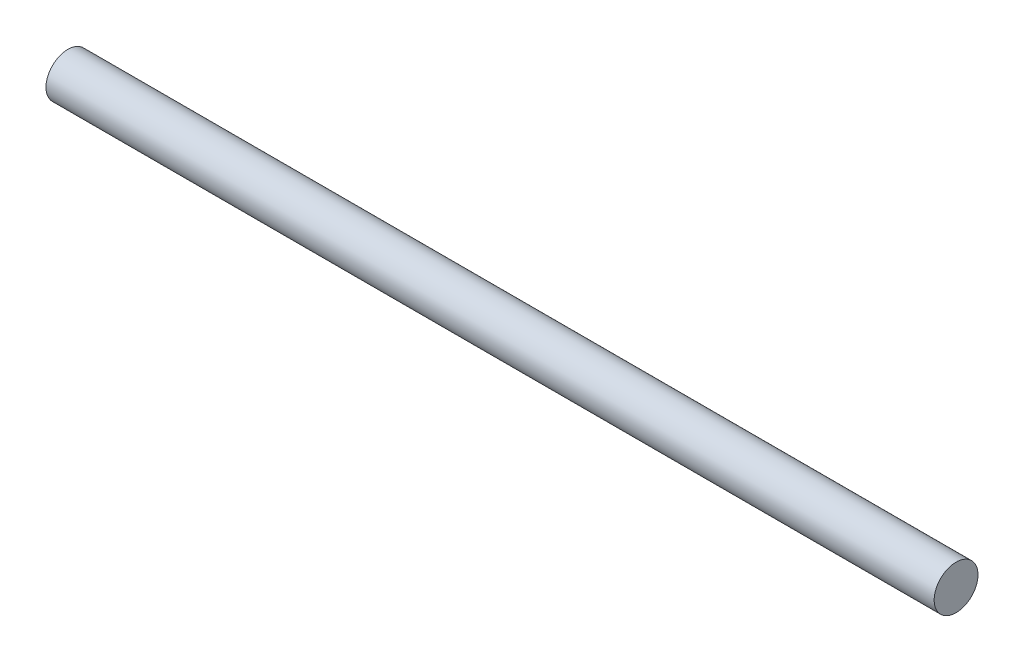
ISO-10303-21;
HEADER;
FILE_DESCRIPTION(('STEP AP214'),'2;1');
FILE_NAME('part.step','',(''),(''),'','','');
FILE_SCHEMA(('AUTOMOTIVE_DESIGN { 1 0 10303 214 1 1 1 1 }'));
ENDSEC;
DATA;
#1=APPLICATION_CONTEXT('core data for automotive mechanical design processes');
#2=APPLICATION_PROTOCOL_DEFINITION('international standard','automotive_design',2000,#1);
#3=PRODUCT_CONTEXT('',#1,'mechanical');
#4=PRODUCT('Part','Part','',(#3));
#5=PRODUCT_RELATED_PRODUCT_CATEGORY('part','',(#4));
#6=PRODUCT_DEFINITION_FORMATION('','',#4);
#7=PRODUCT_DEFINITION_CONTEXT('part definition',#1,'design');
#8=PRODUCT_DEFINITION('design','',#6,#7);
#9=PRODUCT_DEFINITION_SHAPE('','',#8);
#10=(LENGTH_UNIT() NAMED_UNIT(*) SI_UNIT(.MILLI.,.METRE.));
#11=(NAMED_UNIT(*) PLANE_ANGLE_UNIT() SI_UNIT($,.RADIAN.));
#12=(NAMED_UNIT(*) SI_UNIT($,.STERADIAN.) SOLID_ANGLE_UNIT());
#13=UNCERTAINTY_MEASURE_WITH_UNIT(LENGTH_MEASURE(1.E-05),#10,'distance_accuracy_value','');
#14=(GEOMETRIC_REPRESENTATION_CONTEXT(3) GLOBAL_UNCERTAINTY_ASSIGNED_CONTEXT((#13)) GLOBAL_UNIT_ASSIGNED_CONTEXT((#10,
#11,#12)) REPRESENTATION_CONTEXT('',''));
#15=CARTESIAN_POINT('',(0.,0.,0.));
#16=DIRECTION('',(0.,0.,1.));
#17=DIRECTION('',(1.,0.,0.));
#18=AXIS2_PLACEMENT_3D('',#15,#16,#17);
#19=CARTESIAN_POINT('',(-121.540305705,0.,0.));
#20=DIRECTION('',(1.,0.,0.));
#21=DIRECTION('',(0.,0.,-1.));
#22=AXIS2_PLACEMENT_3D('',#19,#20,#21);
#23=CYLINDRICAL_SURFACE('',#22,6.);
#24=CARTESIAN_POINT('',(-121.540305705,0.,0.));
#25=DIRECTION('',(1.,0.,0.));
#26=DIRECTION('',(0.,0.,-1.));
#27=AXIS2_PLACEMENT_3D('',#24,#25,#26);
#28=CIRCLE('',#27,6.);
#29=CARTESIAN_POINT('',(-121.540305705,0.,-6.));
#30=VERTEX_POINT('',#29);
#31=EDGE_CURVE('E10',#30,#30,#28,.T.);
#32=CARTESIAN_POINT('',(121.540305705,0.,0.));
#33=DIRECTION('',(1.,0.,0.));
#34=DIRECTION('',(0.,0.,-1.));
#35=AXIS2_PLACEMENT_3D('',#32,#33,#34);
#36=CIRCLE('',#35,6.);
#37=CARTESIAN_POINT('',(121.540305705,0.,-6.));
#38=VERTEX_POINT('',#37);
#39=EDGE_CURVE('E40',#38,#38,#36,.T.);
#40=CARTESIAN_POINT('',(-121.540305705,0.,-6.));
#41=CARTESIAN_POINT('',(-119.008216002813,0.,-6.));
#42=CARTESIAN_POINT('',(-116.476126300625,0.,-6.));
#43=CARTESIAN_POINT('',(-111.41194689625,0.,-6.));
#44=CARTESIAN_POINT('',(-108.879857194062,0.,-6.));
#45=CARTESIAN_POINT('',(-103.815677789687,0.,-6.));
#46=CARTESIAN_POINT('',(-101.2835880875,0.,-6.));
#47=CARTESIAN_POINT('',(-96.219408683125,0.,-6.));
#48=CARTESIAN_POINT('',(-93.6873189809375,0.,-6.));
#49=CARTESIAN_POINT('',(-88.6231395765625,0.,-6.));
#50=CARTESIAN_POINT('',(-86.091049874375,0.,-6.));
#51=CARTESIAN_POINT('',(-81.02687047,0.,-6.));
#52=CARTESIAN_POINT('',(-78.4947807678125,0.,-6.));
#53=CARTESIAN_POINT('',(-73.4306013634375,0.,-6.));
#54=CARTESIAN_POINT('',(-70.89851166125,0.,-6.));
#55=CARTESIAN_POINT('',(-65.834332256875,0.,-6.));
#56=CARTESIAN_POINT('',(-63.3022425546875,0.,-6.));
#57=CARTESIAN_POINT('',(-58.2380631503125,0.,-6.));
#58=CARTESIAN_POINT('',(-55.705973448125,0.,-6.));
#59=CARTESIAN_POINT('',(-50.64179404375,0.,-6.));
#60=CARTESIAN_POINT('',(-48.1097043415625,0.,-6.));
#61=CARTESIAN_POINT('',(-43.0455249371875,0.,-6.));
#62=CARTESIAN_POINT('',(-40.513435235,0.,-6.));
#63=CARTESIAN_POINT('',(-35.449255830625,0.,-6.));
#64=CARTESIAN_POINT('',(-32.9171661284375,0.,-6.));
#65=CARTESIAN_POINT('',(-27.8529867240625,0.,-6.));
#66=CARTESIAN_POINT('',(-25.320897021875,0.,-6.));
#67=CARTESIAN_POINT('',(-20.2567176175,0.,-6.));
#68=CARTESIAN_POINT('',(-17.7246279153125,0.,-6.));
#69=CARTESIAN_POINT('',(-12.6604485109375,0.,-6.));
#70=CARTESIAN_POINT('',(-10.12835880875,0.,-6.));
#71=CARTESIAN_POINT('',(-5.06417940437501,0.,-6.));
#72=CARTESIAN_POINT('',(-2.53208970218751,0.,-6.));
#73=CARTESIAN_POINT('',(2.53208970218748,0.,-6.));
#74=CARTESIAN_POINT('',(5.06417940437497,0.,-6.));
#75=CARTESIAN_POINT('',(10.12835880875,0.,-6.));
#76=CARTESIAN_POINT('',(12.6604485109375,0.,-6.));
#77=CARTESIAN_POINT('',(17.7246279153125,0.,-6.));
#78=CARTESIAN_POINT('',(20.2567176175,0.,-6.));
#79=CARTESIAN_POINT('',(25.320897021875,0.,-6.));
#80=CARTESIAN_POINT('',(27.8529867240625,0.,-6.));
#81=CARTESIAN_POINT('',(32.9171661284375,0.,-6.));
#82=CARTESIAN_POINT('',(35.449255830625,0.,-6.));
#83=CARTESIAN_POINT('',(40.513435235,0.,-6.));
#84=CARTESIAN_POINT('',(43.0455249371875,0.,-6.));
#85=CARTESIAN_POINT('',(48.1097043415625,0.,-6.));
#86=CARTESIAN_POINT('',(50.64179404375,0.,-6.));
#87=CARTESIAN_POINT('',(55.705973448125,0.,-6.));
#88=CARTESIAN_POINT('',(58.2380631503125,0.,-6.));
#89=CARTESIAN_POINT('',(63.3022425546875,0.,-6.));
#90=CARTESIAN_POINT('',(65.834332256875,0.,-6.));
#91=CARTESIAN_POINT('',(70.89851166125,0.,-6.));
#92=CARTESIAN_POINT('',(73.4306013634375,0.,-6.));
#93=CARTESIAN_POINT('',(78.4947807678125,0.,-6.));
#94=CARTESIAN_POINT('',(81.02687047,0.,-6.));
#95=CARTESIAN_POINT('',(86.091049874375,0.,-6.));
#96=CARTESIAN_POINT('',(88.6231395765625,0.,-6.));
#97=CARTESIAN_POINT('',(93.6873189809375,0.,-6.));
#98=CARTESIAN_POINT('',(96.219408683125,0.,-6.));
#99=CARTESIAN_POINT('',(101.2835880875,0.,-6.));
#100=CARTESIAN_POINT('',(103.815677789687,0.,-6.));
#101=CARTESIAN_POINT('',(108.879857194062,0.,-6.));
#102=CARTESIAN_POINT('',(111.41194689625,0.,-6.));
#103=CARTESIAN_POINT('',(116.476126300625,0.,-6.));
#104=CARTESIAN_POINT('',(119.008216002812,0.,-6.));
#105=CARTESIAN_POINT('',(121.540305705,0.,-6.));
#106=B_SPLINE_CURVE_WITH_KNOTS('',3,(#40,#41,#42,#43,#44,#45,#46,#47,#48,#49,#50,#51,#52,#53,
#54,#55,#56,#57,#58,#59,#60,#61,#62,#63,#64,#65,#66,#67,#68,#69,#70,#71,#72,#73,#74,#75,#76,#77,
#78,#79,#80,#81,#82,#83,#84,#85,#86,#87,#88,#89,#90,#91,#92,#93,#94,#95,#96,#97,#98,#99,#100,
#101,#102,#103,#104,#105),.UNSPECIFIED.,.F.,.F.,(4,2,2,2,2,2,2,2,2,2,2,2,2,2,2,2,2,2,2,2,2,2,2,
2,2,2,2,2,2,2,2,2,4),(0.,7.5962691065625,15.192538213125,22.7888073196875,30.38507642625,
37.9813455328125,45.577614639375,53.1738837459375,60.7701528525,68.3664219590625,
75.962691065625,83.5589601721875,91.15522927875,98.7514983853125,106.347767491875,
113.944036598437,121.540305705,129.136574811562,136.732843918125,144.329113024687,
151.92538213125,159.521651237812,167.117920344375,174.714189450937,182.3104585575,
189.906727664062,197.502996770625,205.099265877187,212.69553498375,220.291804090312,
227.888073196875,235.484342303437,243.08061141),.UNSPECIFIED.);
#107=EDGE_CURVE('BSEAM37',#30,#38,#106,.T.);
#108=ORIENTED_EDGE('',*,*,#31,.T.);
#109=ORIENTED_EDGE('',*,*,#39,.F.);
#110=ORIENTED_EDGE('',*,*,#107,.T.);
#111=ORIENTED_EDGE('',*,*,#107,.F.);
#112=EDGE_LOOP('',(#108,#110,#109,#111));
#113=FACE_BOUND('',#112,.T.);
#114=ADVANCED_FACE('F37',(#113),#23,.T.);
#115=CARTESIAN_POINT('',(-121.540305705,0.,0.));
#116=DIRECTION('',(1.,0.,0.));
#117=DIRECTION('',(0.,0.,-1.));
#118=AXIS2_PLACEMENT_3D('',#115,#116,#117);
#119=PLANE('',#118);
#120=ORIENTED_EDGE('',*,*,#31,.F.);
#121=EDGE_LOOP('',(#120));
#122=FACE_BOUND('',#121,.T.);
#123=ADVANCED_FACE('F52',(#122),#119,.F.);
#124=CARTESIAN_POINT('',(121.540305705,0.,0.));
#125=DIRECTION('',(1.,0.,0.));
#126=DIRECTION('',(0.,0.,-1.));
#127=AXIS2_PLACEMENT_3D('',#124,#125,#126);
#128=PLANE('',#127);
#129=ORIENTED_EDGE('',*,*,#39,.T.);
#130=EDGE_LOOP('',(#129));
#131=FACE_BOUND('',#130,.T.);
#132=ADVANCED_FACE('F49',(#131),#128,.T.);
#133=CLOSED_SHELL('',(#114,#123,#132));
#134=MANIFOLD_SOLID_BREP('B2',#133);
#135=ADVANCED_BREP_SHAPE_REPRESENTATION('',(#18,#134),#14);
#136=SHAPE_DEFINITION_REPRESENTATION(#9,#135);
ENDSEC;
END-ISO-10303-21;
